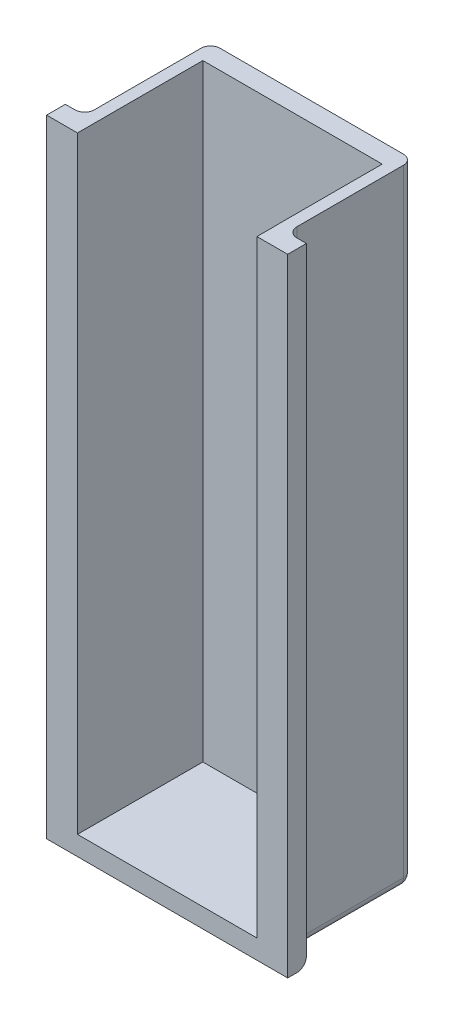
ISO-10303-21;
HEADER;
FILE_DESCRIPTION(('STEP AP214'),'2;1');
FILE_NAME('part.step','',(''),(''),'','','');
FILE_SCHEMA(('AUTOMOTIVE_DESIGN { 1 0 10303 214 1 1 1 1 }'));
ENDSEC;
DATA;
#1=APPLICATION_CONTEXT('core data for automotive mechanical design processes');
#2=APPLICATION_PROTOCOL_DEFINITION('international standard','automotive_design',2000,#1);
#3=PRODUCT_CONTEXT('',#1,'mechanical');
#4=PRODUCT('Part','Part','',(#3));
#5=PRODUCT_RELATED_PRODUCT_CATEGORY('part','',(#4));
#6=PRODUCT_DEFINITION_FORMATION('','',#4);
#7=PRODUCT_DEFINITION_CONTEXT('part definition',#1,'design');
#8=PRODUCT_DEFINITION('design','',#6,#7);
#9=PRODUCT_DEFINITION_SHAPE('','',#8);
#10=(LENGTH_UNIT() NAMED_UNIT(*) SI_UNIT(.MILLI.,.METRE.));
#11=(NAMED_UNIT(*) PLANE_ANGLE_UNIT() SI_UNIT($,.RADIAN.));
#12=(NAMED_UNIT(*) SI_UNIT($,.STERADIAN.) SOLID_ANGLE_UNIT());
#13=UNCERTAINTY_MEASURE_WITH_UNIT(LENGTH_MEASURE(1.E-05),#10,'distance_accuracy_value','');
#14=(GEOMETRIC_REPRESENTATION_CONTEXT(3) GLOBAL_UNCERTAINTY_ASSIGNED_CONTEXT((#13)) GLOBAL_UNIT_ASSIGNED_CONTEXT((#10,
#11,#12)) REPRESENTATION_CONTEXT('',''));
#15=CARTESIAN_POINT('',(0.,0.,0.));
#16=DIRECTION('',(0.,0.,1.));
#17=DIRECTION('',(1.,0.,0.));
#18=AXIS2_PLACEMENT_3D('',#15,#16,#17);
#19=CARTESIAN_POINT('',(12.5,-32.5,15.));
#20=DIRECTION('',(-1.,0.,0.));
#21=DIRECTION('',(0.,0.,1.));
#22=AXIS2_PLACEMENT_3D('',#19,#20,#21);
#23=PLANE('',#22);
#24=DIRECTION('',(0.,0.,-1.));
#25=VECTOR('',#24,1.);
#26=CARTESIAN_POINT('',(12.5,-32.5,15.));
#27=LINE('',#26,#25);
#28=CARTESIAN_POINT('',(12.5,-32.5,15.));
#29=VERTEX_POINT('',#28);
#30=CARTESIAN_POINT('',(12.5,-32.5,14.0553964783934));
#31=VERTEX_POINT('',#30);
#32=EDGE_CURVE('E230',#29,#31,#27,.T.);
#33=ORIENTED_EDGE('',*,*,#32,.T.);
#34=CARTESIAN_POINT('',(12.5,-31.5,14.0553964783934));
#35=DIRECTION('',(-1.,0.,0.));
#36=DIRECTION('',(0.,0.,1.));
#37=AXIS2_PLACEMENT_3D('',#34,#35,#36);
#38=CIRCLE('',#37,1.);
#39=CARTESIAN_POINT('',(12.5,-31.5,13.0553964783934));
#40=VERTEX_POINT('',#39);
#41=EDGE_CURVE('E265',#31,#40,#38,.F.);
#42=ORIENTED_EDGE('',*,*,#41,.T.);
#43=DIRECTION('',(0.,1.,0.));
#44=VECTOR('',#43,1.);
#45=CARTESIAN_POINT('',(12.5,-32.5,13.0553964783934));
#46=LINE('',#45,#44);
#47=CARTESIAN_POINT('',(12.5,32.5,13.0553964783934));
#48=VERTEX_POINT('',#47);
#49=EDGE_CURVE('E358',#40,#48,#46,.T.);
#50=ORIENTED_EDGE('',*,*,#49,.T.);
#51=DIRECTION('',(0.,0.,-1.));
#52=VECTOR('',#51,1.);
#53=CARTESIAN_POINT('',(12.5,32.5,15.));
#54=LINE('',#53,#52);
#55=CARTESIAN_POINT('',(12.5,32.5,15.));
#56=VERTEX_POINT('',#55);
#57=EDGE_CURVE('E239',#56,#48,#54,.T.);
#58=ORIENTED_EDGE('',*,*,#57,.F.);
#59=DIRECTION('',(0.,1.,0.));
#60=VECTOR('',#59,1.);
#61=CARTESIAN_POINT('',(12.5,-32.5,15.));
#62=LINE('',#61,#60);
#63=EDGE_CURVE('E218',#29,#56,#62,.T.);
#64=ORIENTED_EDGE('',*,*,#63,.F.);
#65=EDGE_LOOP('',(#33,#42,#50,#58,#64));
#66=FACE_BOUND('',#65,.T.);
#67=ADVANCED_FACE('F39',(#66),#23,.F.);
#68=CARTESIAN_POINT('',(-12.5,32.5,15.));
#69=DIRECTION('',(0.,-1.,0.));
#70=DIRECTION('',(0.,0.,-1.));
#71=AXIS2_PLACEMENT_3D('',#68,#69,#70);
#72=PLANE('',#71);
#73=DIRECTION('',(-1.,0.,0.));
#74=VECTOR('',#73,1.);
#75=CARTESIAN_POINT('',(-12.5,32.5,0.));
#76=LINE('',#75,#74);
#77=CARTESIAN_POINT('',(9.50269534961136,32.5,0.));
#78=VERTEX_POINT('',#77);
#79=CARTESIAN_POINT('',(-9.50269534961136,32.5,0.));
#80=VERTEX_POINT('',#79);
#81=EDGE_CURVE('E223',#78,#80,#76,.T.);
#82=ORIENTED_EDGE('',*,*,#81,.T.);
#83=CARTESIAN_POINT('',(-9.50269534961136,32.5,1.));
#84=DIRECTION('',(0.,-1.,0.));
#85=DIRECTION('',(0.,0.,-1.));
#86=AXIS2_PLACEMENT_3D('',#83,#84,#85);
#87=CIRCLE('',#86,1.);
#88=CARTESIAN_POINT('',(-10.5026953496114,32.5,1.));
#89=VERTEX_POINT('',#88);
#90=EDGE_CURVE('E289',#80,#89,#87,.F.);
#91=ORIENTED_EDGE('',*,*,#90,.T.);
#92=DIRECTION('',(0.,0.,1.));
#93=VECTOR('',#92,1.);
#94=CARTESIAN_POINT('',(-10.5026953496114,32.5,15.));
#95=LINE('',#94,#93);
#96=CARTESIAN_POINT('',(-10.5026953496114,32.5,12.0553964783934));
#97=VERTEX_POINT('',#96);
#98=EDGE_CURVE('E370',#89,#97,#95,.T.);
#99=ORIENTED_EDGE('',*,*,#98,.T.);
#100=CARTESIAN_POINT('',(-11.5026953496114,32.5,12.0553964783934));
#101=DIRECTION('',(0.,-1.,0.));
#102=DIRECTION('',(0.,0.,-1.));
#103=AXIS2_PLACEMENT_3D('',#100,#101,#102);
#104=CIRCLE('',#103,1.);
#105=CARTESIAN_POINT('',(-11.5026953496114,32.5,13.0553964783934));
#106=VERTEX_POINT('',#105);
#107=EDGE_CURVE('E48',#97,#106,#104,.T.);
#108=ORIENTED_EDGE('',*,*,#107,.T.);
#109=DIRECTION('',(-1.,0.,0.));
#110=VECTOR('',#109,1.);
#111=CARTESIAN_POINT('',(-12.5,32.5,13.0553964783934));
#112=LINE('',#111,#110);
#113=CARTESIAN_POINT('',(-12.5,32.5,13.0553964783934));
#114=VERTEX_POINT('',#113);
#115=EDGE_CURVE('E232',#106,#114,#112,.T.);
#116=ORIENTED_EDGE('',*,*,#115,.T.);
#117=DIRECTION('',(0.,0.,-1.));
#118=VECTOR('',#117,1.);
#119=CARTESIAN_POINT('',(-12.5,32.5,15.));
#120=LINE('',#119,#118);
#121=CARTESIAN_POINT('',(-12.5,32.5,15.));
#122=VERTEX_POINT('',#121);
#123=EDGE_CURVE('E215',#122,#114,#120,.T.);
#124=ORIENTED_EDGE('',*,*,#123,.F.);
#125=DIRECTION('',(-1.,0.,0.));
#126=VECTOR('',#125,1.);
#127=CARTESIAN_POINT('',(-12.5,32.5,15.));
#128=LINE('',#127,#126);
#129=CARTESIAN_POINT('',(-9.29999999999967,32.5,15.));
#130=VERTEX_POINT('',#129);
#131=EDGE_CURVE('E205',#130,#122,#128,.T.);
#132=ORIENTED_EDGE('',*,*,#131,.F.);
#133=DIRECTION('',(0.,0.,1.));
#134=VECTOR('',#133,1.);
#135=CARTESIAN_POINT('',(-9.29999999999967,32.5,1.99771840831441));
#136=LINE('',#135,#134);
#137=CARTESIAN_POINT('',(-9.29999999999967,32.5,1.99771840831441));
#138=VERTEX_POINT('',#137);
#139=EDGE_CURVE('E189',#138,#130,#136,.T.);
#140=ORIENTED_EDGE('',*,*,#139,.F.);
#141=DIRECTION('',(-1.,0.,0.));
#142=VECTOR('',#141,1.);
#143=CARTESIAN_POINT('',(-9.29999999999967,32.5,1.99771840831441));
#144=LINE('',#143,#142);
#145=CARTESIAN_POINT('',(9.29999999999967,32.5,1.99771840831441));
#146=VERTEX_POINT('',#145);
#147=EDGE_CURVE('E347',#146,#138,#144,.T.);
#148=ORIENTED_EDGE('',*,*,#147,.F.);
#149=DIRECTION('',(0.,0.,-1.));
#150=VECTOR('',#149,1.);
#151=CARTESIAN_POINT('',(9.29999999999967,32.5,1.99771840831441));
#152=LINE('',#151,#150);
#153=CARTESIAN_POINT('',(9.29999999999967,32.5,12.9625452365219));
#154=VERTEX_POINT('',#153);
#155=EDGE_CURVE('E200',#154,#146,#152,.T.);
#156=ORIENTED_EDGE('',*,*,#155,.F.);
#157=DIRECTION('',(-1.,0.,0.));
#158=VECTOR('',#157,1.);
#159=CARTESIAN_POINT('',(-9.29999999999967,32.5,12.9625452365219));
#160=LINE('',#159,#158);
#161=CARTESIAN_POINT('',(9.31058078052405,32.5,12.9625452365219));
#162=VERTEX_POINT('',#161);
#163=EDGE_CURVE('E210',#162,#154,#160,.T.);
#164=ORIENTED_EDGE('',*,*,#163,.F.);
#165=DIRECTION('',(0.,0.,-1.));
#166=VECTOR('',#165,1.);
#167=CARTESIAN_POINT('',(9.31058078052405,32.5,12.9625452365219));
#168=LINE('',#167,#166);
#169=CARTESIAN_POINT('',(9.31058078052405,32.5,15.));
#170=VERTEX_POINT('',#169);
#171=EDGE_CURVE('E326',#170,#162,#168,.T.);
#172=ORIENTED_EDGE('',*,*,#171,.F.);
#173=EDGE_CURVE('E217',#56,#170,#128,.T.);
#174=ORIENTED_EDGE('',*,*,#173,.F.);
#175=ORIENTED_EDGE('',*,*,#57,.T.);
#176=DIRECTION('',(-1.,0.,0.));
#177=VECTOR('',#176,1.);
#178=CARTESIAN_POINT('',(-12.5,32.5,13.0553964783934));
#179=LINE('',#178,#177);
#180=CARTESIAN_POINT('',(11.5026953496114,32.5,13.0553964783934));
#181=VERTEX_POINT('',#180);
#182=EDGE_CURVE('E373',#48,#181,#179,.T.);
#183=ORIENTED_EDGE('',*,*,#182,.T.);
#184=CARTESIAN_POINT('',(11.5026953496114,32.5,12.0553964783934));
#185=DIRECTION('',(0.,-1.,0.));
#186=DIRECTION('',(0.,0.,-1.));
#187=AXIS2_PLACEMENT_3D('',#184,#185,#186);
#188=CIRCLE('',#187,1.);
#189=CARTESIAN_POINT('',(10.5026953496114,32.5,12.0553964783934));
#190=VERTEX_POINT('',#189);
#191=EDGE_CURVE('E11',#181,#190,#188,.T.);
#192=ORIENTED_EDGE('',*,*,#191,.T.);
#193=DIRECTION('',(0.,0.,-1.));
#194=VECTOR('',#193,1.);
#195=CARTESIAN_POINT('',(10.5026953496114,32.5,15.));
#196=LINE('',#195,#194);
#197=CARTESIAN_POINT('',(10.5026953496114,32.5,1.));
#198=VERTEX_POINT('',#197);
#199=EDGE_CURVE('E366',#190,#198,#196,.T.);
#200=ORIENTED_EDGE('',*,*,#199,.T.);
#201=CARTESIAN_POINT('',(9.50269534961136,32.5,1.));
#202=DIRECTION('',(0.,-1.,0.));
#203=DIRECTION('',(0.,0.,-1.));
#204=AXIS2_PLACEMENT_3D('',#201,#202,#203);
#205=CIRCLE('',#204,1.);
#206=EDGE_CURVE('E287',#198,#78,#205,.F.);
#207=ORIENTED_EDGE('',*,*,#206,.T.);
#208=EDGE_LOOP('',(#82,#91,#99,#108,#116,#124,#132,#140,#148,#156,#164,#172,#174,#175,#183,#192,
#200,#207));
#209=FACE_BOUND('',#208,.T.);
#210=ADVANCED_FACE('F213',(#209),#72,.F.);
#211=CARTESIAN_POINT('',(-12.5,-32.5,15.));
#212=DIRECTION('',(1.,0.,0.));
#213=DIRECTION('',(0.,0.,-1.));
#214=AXIS2_PLACEMENT_3D('',#211,#212,#213);
#215=PLANE('',#214);
#216=DIRECTION('',(0.,1.,0.));
#217=VECTOR('',#216,1.);
#218=CARTESIAN_POINT('',(-12.5,-32.5,13.0553964783934));
#219=LINE('',#218,#217);
#220=CARTESIAN_POINT('',(-12.5,-31.5,13.0553964783934));
#221=VERTEX_POINT('',#220);
#222=EDGE_CURVE('E363',#221,#114,#219,.T.);
#223=ORIENTED_EDGE('',*,*,#222,.F.);
#224=CARTESIAN_POINT('',(-12.5,-31.5,14.0553964783934));
#225=DIRECTION('',(1.,0.,0.));
#226=DIRECTION('',(0.,0.,-1.));
#227=AXIS2_PLACEMENT_3D('',#224,#225,#226);
#228=CIRCLE('',#227,1.);
#229=CARTESIAN_POINT('',(-12.5,-32.5,14.0553964783934));
#230=VERTEX_POINT('',#229);
#231=EDGE_CURVE('E263',#221,#230,#228,.F.);
#232=ORIENTED_EDGE('',*,*,#231,.T.);
#233=DIRECTION('',(0.,0.,-1.));
#234=VECTOR('',#233,1.);
#235=CARTESIAN_POINT('',(-12.5,-32.5,15.));
#236=LINE('',#235,#234);
#237=CARTESIAN_POINT('',(-12.5,-32.5,15.));
#238=VERTEX_POINT('',#237);
#239=EDGE_CURVE('E235',#238,#230,#236,.T.);
#240=ORIENTED_EDGE('',*,*,#239,.F.);
#241=DIRECTION('',(0.,-1.,0.));
#242=VECTOR('',#241,1.);
#243=CARTESIAN_POINT('',(-12.5,-32.5,15.));
#244=LINE('',#243,#242);
#245=EDGE_CURVE('E221',#122,#238,#244,.T.);
#246=ORIENTED_EDGE('',*,*,#245,.F.);
#247=ORIENTED_EDGE('',*,*,#123,.T.);
#248=EDGE_LOOP('',(#223,#232,#240,#246,#247));
#249=FACE_BOUND('',#248,.T.);
#250=ADVANCED_FACE('F384',(#249),#215,.F.);
#251=CARTESIAN_POINT('',(-12.5,-32.5,15.));
#252=DIRECTION('',(0.,1.,0.));
#253=DIRECTION('',(0.,0.,1.));
#254=AXIS2_PLACEMENT_3D('',#251,#252,#253);
#255=PLANE('',#254);
#256=CARTESIAN_POINT('',(11.5026953496114,-32.5,12.0553964783934));
#257=DIRECTION('',(0.,1.,0.));
#258=DIRECTION('',(0.,0.,1.));
#259=AXIS2_PLACEMENT_3D('',#256,#257,#258);
#260=CIRCLE('',#259,2.);
#261=CARTESIAN_POINT('',(11.5026953496114,-32.5,14.0553964783934));
#262=VERTEX_POINT('',#261);
#263=CARTESIAN_POINT('',(9.50269534961136,-32.5,12.0553964783934));
#264=VERTEX_POINT('',#263);
#265=EDGE_CURVE('E254',#262,#264,#260,.F.);
#266=ORIENTED_EDGE('',*,*,#265,.F.);
#267=DIRECTION('',(1.,0.,0.));
#268=VECTOR('',#267,1.);
#269=CARTESIAN_POINT('',(-12.5,-32.5,14.0553964783934));
#270=LINE('',#269,#268);
#271=EDGE_CURVE('E257',#262,#31,#270,.T.);
#272=ORIENTED_EDGE('',*,*,#271,.T.);
#273=ORIENTED_EDGE('',*,*,#32,.F.);
#274=DIRECTION('',(1.,0.,0.));
#275=VECTOR('',#274,1.);
#276=CARTESIAN_POINT('',(-12.5,-32.5,15.));
#277=LINE('',#276,#275);
#278=EDGE_CURVE('E228',#238,#29,#277,.T.);
#279=ORIENTED_EDGE('',*,*,#278,.F.);
#280=ORIENTED_EDGE('',*,*,#239,.T.);
#281=DIRECTION('',(1.,0.,0.));
#282=VECTOR('',#281,1.);
#283=CARTESIAN_POINT('',(-12.5,-32.5,14.0553964783934));
#284=LINE('',#283,#282);
#285=CARTESIAN_POINT('',(-11.5026953496114,-32.5,14.0553964783934));
#286=VERTEX_POINT('',#285);
#287=EDGE_CURVE('E251',#230,#286,#284,.T.);
#288=ORIENTED_EDGE('',*,*,#287,.T.);
#289=CARTESIAN_POINT('',(-11.5026953496114,-32.5,12.0553964783934));
#290=DIRECTION('',(0.,1.,0.));
#291=DIRECTION('',(0.,0.,1.));
#292=AXIS2_PLACEMENT_3D('',#289,#290,#291);
#293=CIRCLE('',#292,2.);
#294=CARTESIAN_POINT('',(-9.50269534961136,-32.5,12.0553964783934));
#295=VERTEX_POINT('',#294);
#296=EDGE_CURVE('E248',#295,#286,#293,.F.);
#297=ORIENTED_EDGE('',*,*,#296,.F.);
#298=DIRECTION('',(0.,0.,-1.));
#299=VECTOR('',#298,1.);
#300=CARTESIAN_POINT('',(-9.50269534961136,-32.5,15.));
#301=LINE('',#300,#299);
#302=CARTESIAN_POINT('',(-9.50269534961136,-32.5,1.));
#303=VERTEX_POINT('',#302);
#304=EDGE_CURVE('E246',#295,#303,#301,.T.);
#305=ORIENTED_EDGE('',*,*,#304,.T.);
#306=DIRECTION('',(1.,0.,0.));
#307=VECTOR('',#306,1.);
#308=CARTESIAN_POINT('',(10.5026953496114,-32.5,1.));
#309=LINE('',#308,#307);
#310=CARTESIAN_POINT('',(9.50269534961136,-32.5,1.));
#311=VERTEX_POINT('',#310);
#312=EDGE_CURVE('E242',#303,#311,#309,.T.);
#313=ORIENTED_EDGE('',*,*,#312,.T.);
#314=DIRECTION('',(0.,0.,1.));
#315=VECTOR('',#314,1.);
#316=CARTESIAN_POINT('',(9.50269534961136,-32.5,15.));
#317=LINE('',#316,#315);
#318=EDGE_CURVE('E244',#311,#264,#317,.T.);
#319=ORIENTED_EDGE('',*,*,#318,.T.);
#320=EDGE_LOOP('',(#266,#272,#273,#279,#280,#288,#297,#305,#313,#319));
#321=FACE_BOUND('',#320,.T.);
#322=ADVANCED_FACE('F391',(#321),#255,.F.);
#323=CARTESIAN_POINT('',(0.,0.,15.));
#324=DIRECTION('',(0.,0.,-1.));
#325=DIRECTION('',(-1.,0.,0.));
#326=AXIS2_PLACEMENT_3D('',#323,#324,#325);
#327=PLANE('',#326);
#328=DIRECTION('',(-1.,0.,0.));
#329=VECTOR('',#328,1.);
#330=CARTESIAN_POINT('',(-9.29999999999967,-30.5,15.));
#331=LINE('',#330,#329);
#332=CARTESIAN_POINT('',(9.31058078052405,-30.5,15.));
#333=VERTEX_POINT('',#332);
#334=CARTESIAN_POINT('',(-9.29999999999967,-30.5,15.));
#335=VERTEX_POINT('',#334);
#336=EDGE_CURVE('E201',#333,#335,#331,.T.);
#337=ORIENTED_EDGE('',*,*,#336,.T.);
#338=DIRECTION('',(0.,1.,0.));
#339=VECTOR('',#338,1.);
#340=CARTESIAN_POINT('',(-9.29999999999967,-49.2217771298993,15.));
#341=LINE('',#340,#339);
#342=EDGE_CURVE('E193',#335,#130,#341,.T.);
#343=ORIENTED_EDGE('',*,*,#342,.T.);
#344=ORIENTED_EDGE('',*,*,#131,.T.);
#345=ORIENTED_EDGE('',*,*,#245,.T.);
#346=ORIENTED_EDGE('',*,*,#278,.T.);
#347=ORIENTED_EDGE('',*,*,#63,.T.);
#348=ORIENTED_EDGE('',*,*,#173,.T.);
#349=DIRECTION('',(0.,1.,0.));
#350=VECTOR('',#349,1.);
#351=CARTESIAN_POINT('',(9.31058078052405,-49.2217771298993,15.));
#352=LINE('',#351,#350);
#353=EDGE_CURVE('E209',#333,#170,#352,.T.);
#354=ORIENTED_EDGE('',*,*,#353,.F.);
#355=EDGE_LOOP('',(#337,#343,#344,#345,#346,#347,#348,#354));
#356=FACE_BOUND('',#355,.T.);
#357=ADVANCED_FACE('F204',(#356),#327,.F.);
#358=CARTESIAN_POINT('',(0.,0.,0.));
#359=DIRECTION('',(0.,0.,-1.));
#360=DIRECTION('',(-1.,0.,0.));
#361=AXIS2_PLACEMENT_3D('',#358,#359,#360);
#362=PLANE('',#361);
#363=DIRECTION('',(1.,0.,0.));
#364=VECTOR('',#363,1.);
#365=CARTESIAN_POINT('',(-10.5026953496114,-31.5,0.));
#366=LINE('',#365,#364);
#367=CARTESIAN_POINT('',(9.50269534961136,-31.5,0.));
#368=VERTEX_POINT('',#367);
#369=CARTESIAN_POINT('',(-9.50269534961136,-31.5,0.));
#370=VERTEX_POINT('',#369);
#371=EDGE_CURVE('E56',#368,#370,#366,.F.);
#372=ORIENTED_EDGE('',*,*,#371,.T.);
#373=DIRECTION('',(0.,1.,0.));
#374=VECTOR('',#373,1.);
#375=CARTESIAN_POINT('',(-9.50269534961136,32.5,0.));
#376=LINE('',#375,#374);
#377=EDGE_CURVE('E285',#370,#80,#376,.T.);
#378=ORIENTED_EDGE('',*,*,#377,.T.);
#379=ORIENTED_EDGE('',*,*,#81,.F.);
#380=DIRECTION('',(0.,1.,0.));
#381=VECTOR('',#380,1.);
#382=CARTESIAN_POINT('',(9.50269534961136,-32.5,0.));
#383=LINE('',#382,#381);
#384=EDGE_CURVE('E61',#78,#368,#383,.F.);
#385=ORIENTED_EDGE('',*,*,#384,.T.);
#386=EDGE_LOOP('',(#372,#378,#379,#385));
#387=FACE_BOUND('',#386,.T.);
#388=ADVANCED_FACE('F495',(#387),#362,.T.);
#389=CARTESIAN_POINT('',(12.5,-32.5,13.0553964783934));
#390=DIRECTION('',(0.,0.,1.));
#391=DIRECTION('',(1.,0.,0.));
#392=AXIS2_PLACEMENT_3D('',#389,#390,#391);
#393=PLANE('',#392);
#394=ORIENTED_EDGE('',*,*,#49,.F.);
#395=DIRECTION('',(1.,0.,0.));
#396=VECTOR('',#395,1.);
#397=CARTESIAN_POINT('',(12.5,-31.5,13.0553964783934));
#398=LINE('',#397,#396);
#399=CARTESIAN_POINT('',(11.5026953496114,-31.5,13.0553964783934));
#400=VERTEX_POINT('',#399);
#401=EDGE_CURVE('E269',#40,#400,#398,.F.);
#402=ORIENTED_EDGE('',*,*,#401,.T.);
#403=DIRECTION('',(0.,1.,0.));
#404=VECTOR('',#403,1.);
#405=CARTESIAN_POINT('',(11.5026953496114,32.5,13.0553964783934));
#406=LINE('',#405,#404);
#407=EDGE_CURVE('E267',#400,#181,#406,.T.);
#408=ORIENTED_EDGE('',*,*,#407,.T.);
#409=ORIENTED_EDGE('',*,*,#182,.F.);
#410=EDGE_LOOP('',(#394,#402,#408,#409));
#411=FACE_BOUND('',#410,.T.);
#412=ADVANCED_FACE('F507',(#411),#393,.F.);
#413=CARTESIAN_POINT('',(10.5026953496114,-32.5,0.));
#414=DIRECTION('',(-1.,0.,0.));
#415=DIRECTION('',(0.,0.,1.));
#416=AXIS2_PLACEMENT_3D('',#413,#414,#415);
#417=PLANE('',#416);
#418=ORIENTED_EDGE('',*,*,#199,.F.);
#419=DIRECTION('',(0.,1.,0.));
#420=VECTOR('',#419,1.);
#421=CARTESIAN_POINT('',(10.5026953496114,-32.5,12.0553964783934));
#422=LINE('',#421,#420);
#423=CARTESIAN_POINT('',(10.5026953496114,-31.5,12.0553964783934));
#424=VERTEX_POINT('',#423);
#425=EDGE_CURVE('E281',#190,#424,#422,.F.);
#426=ORIENTED_EDGE('',*,*,#425,.T.);
#427=DIRECTION('',(0.,0.,1.));
#428=VECTOR('',#427,1.);
#429=CARTESIAN_POINT('',(10.5026953496114,-31.5,0.));
#430=LINE('',#429,#428);
#431=CARTESIAN_POINT('',(10.5026953496114,-31.5,1.));
#432=VERTEX_POINT('',#431);
#433=EDGE_CURVE('E279',#424,#432,#430,.F.);
#434=ORIENTED_EDGE('',*,*,#433,.T.);
#435=DIRECTION('',(0.,1.,0.));
#436=VECTOR('',#435,1.);
#437=CARTESIAN_POINT('',(10.5026953496114,32.5,1.));
#438=LINE('',#437,#436);
#439=EDGE_CURVE('E277',#432,#198,#438,.T.);
#440=ORIENTED_EDGE('',*,*,#439,.T.);
#441=EDGE_LOOP('',(#418,#426,#434,#440));
#442=FACE_BOUND('',#441,.T.);
#443=ADVANCED_FACE('F482',(#442),#417,.F.);
#444=CARTESIAN_POINT('',(-12.5,-32.5,13.0553964783934));
#445=DIRECTION('',(0.,0.,1.));
#446=DIRECTION('',(1.,0.,0.));
#447=AXIS2_PLACEMENT_3D('',#444,#445,#446);
#448=PLANE('',#447);
#449=DIRECTION('',(0.,1.,0.));
#450=VECTOR('',#449,1.);
#451=CARTESIAN_POINT('',(-11.5026953496114,-32.5,13.0553964783934));
#452=LINE('',#451,#450);
#453=CARTESIAN_POINT('',(-11.5026953496114,-31.5,13.0553964783934));
#454=VERTEX_POINT('',#453);
#455=EDGE_CURVE('E259',#106,#454,#452,.F.);
#456=ORIENTED_EDGE('',*,*,#455,.T.);
#457=DIRECTION('',(1.,0.,0.));
#458=VECTOR('',#457,1.);
#459=CARTESIAN_POINT('',(-12.5,-31.5,13.0553964783934));
#460=LINE('',#459,#458);
#461=EDGE_CURVE('E261',#454,#221,#460,.F.);
#462=ORIENTED_EDGE('',*,*,#461,.T.);
#463=ORIENTED_EDGE('',*,*,#222,.T.);
#464=ORIENTED_EDGE('',*,*,#115,.F.);
#465=EDGE_LOOP('',(#456,#462,#463,#464));
#466=FACE_BOUND('',#465,.T.);
#467=ADVANCED_FACE('F380',(#466),#448,.F.);
#468=CARTESIAN_POINT('',(-10.5026953496114,-32.5,0.));
#469=DIRECTION('',(1.,0.,0.));
#470=DIRECTION('',(0.,0.,-1.));
#471=AXIS2_PLACEMENT_3D('',#468,#469,#470);
#472=PLANE('',#471);
#473=DIRECTION('',(0.,0.,-1.));
#474=VECTOR('',#473,1.);
#475=CARTESIAN_POINT('',(-10.5026953496114,-31.5,0.));
#476=LINE('',#475,#474);
#477=CARTESIAN_POINT('',(-10.5026953496114,-31.5,1.));
#478=VERTEX_POINT('',#477);
#479=CARTESIAN_POINT('',(-10.5026953496114,-31.5,12.0553964783934));
#480=VERTEX_POINT('',#479);
#481=EDGE_CURVE('E273',#478,#480,#476,.F.);
#482=ORIENTED_EDGE('',*,*,#481,.T.);
#483=DIRECTION('',(0.,1.,0.));
#484=VECTOR('',#483,1.);
#485=CARTESIAN_POINT('',(-10.5026953496114,32.5,12.0553964783934));
#486=LINE('',#485,#484);
#487=EDGE_CURVE('E275',#480,#97,#486,.T.);
#488=ORIENTED_EDGE('',*,*,#487,.T.);
#489=ORIENTED_EDGE('',*,*,#98,.F.);
#490=DIRECTION('',(0.,1.,0.));
#491=VECTOR('',#490,1.);
#492=CARTESIAN_POINT('',(-10.5026953496114,-32.5,1.));
#493=LINE('',#492,#491);
#494=EDGE_CURVE('E271',#89,#478,#493,.F.);
#495=ORIENTED_EDGE('',*,*,#494,.T.);
#496=EDGE_LOOP('',(#482,#488,#489,#495));
#497=FACE_BOUND('',#496,.T.);
#498=ADVANCED_FACE('F498',(#497),#472,.F.);
#499=CARTESIAN_POINT('',(-9.29999999999967,-30.5,1.99771840831441));
#500=DIRECTION('',(-1.,0.,0.));
#501=DIRECTION('',(0.,0.,1.));
#502=AXIS2_PLACEMENT_3D('',#499,#500,#501);
#503=PLANE('',#502);
#504=ORIENTED_EDGE('',*,*,#139,.T.);
#505=ORIENTED_EDGE('',*,*,#342,.F.);
#506=DIRECTION('',(0.,0.,1.));
#507=VECTOR('',#506,1.);
#508=CARTESIAN_POINT('',(-9.29999999999967,-30.5,1.99771840831441));
#509=LINE('',#508,#507);
#510=CARTESIAN_POINT('',(-9.29999999999967,-30.5,1.99771840831441));
#511=VERTEX_POINT('',#510);
#512=EDGE_CURVE('E344',#511,#335,#509,.T.);
#513=ORIENTED_EDGE('',*,*,#512,.F.);
#514=DIRECTION('',(0.,1.,0.));
#515=VECTOR('',#514,1.);
#516=CARTESIAN_POINT('',(-9.29999999999967,-30.5,1.99771840831441));
#517=LINE('',#516,#515);
#518=EDGE_CURVE('E195',#511,#138,#517,.T.);
#519=ORIENTED_EDGE('',*,*,#518,.T.);
#520=EDGE_LOOP('',(#504,#505,#513,#519));
#521=FACE_BOUND('',#520,.T.);
#522=ADVANCED_FACE('F191',(#521),#503,.F.);
#523=CARTESIAN_POINT('',(-9.29999999999967,-30.5,1.99771840831441));
#524=DIRECTION('',(0.,0.,-1.));
#525=DIRECTION('',(-1.,0.,0.));
#526=AXIS2_PLACEMENT_3D('',#523,#524,#525);
#527=PLANE('',#526);
#528=ORIENTED_EDGE('',*,*,#147,.T.);
#529=ORIENTED_EDGE('',*,*,#518,.F.);
#530=DIRECTION('',(-1.,0.,0.));
#531=VECTOR('',#530,1.);
#532=CARTESIAN_POINT('',(-9.29999999999967,-30.5,1.99771840831441));
#533=LINE('',#532,#531);
#534=CARTESIAN_POINT('',(9.29999999999967,-30.5,1.99771840831441));
#535=VERTEX_POINT('',#534);
#536=EDGE_CURVE('E350',#535,#511,#533,.T.);
#537=ORIENTED_EDGE('',*,*,#536,.F.);
#538=DIRECTION('',(0.,1.,0.));
#539=VECTOR('',#538,1.);
#540=CARTESIAN_POINT('',(9.29999999999967,-30.5,1.99771840831441));
#541=LINE('',#540,#539);
#542=EDGE_CURVE('E359',#535,#146,#541,.T.);
#543=ORIENTED_EDGE('',*,*,#542,.T.);
#544=EDGE_LOOP('',(#528,#529,#537,#543));
#545=FACE_BOUND('',#544,.T.);
#546=ADVANCED_FACE('F405',(#545),#527,.F.);
#547=CARTESIAN_POINT('',(9.29999999999967,-30.5,1.99771840831441));
#548=DIRECTION('',(1.,0.,0.));
#549=DIRECTION('',(0.,0.,-1.));
#550=AXIS2_PLACEMENT_3D('',#547,#548,#549);
#551=PLANE('',#550);
#552=ORIENTED_EDGE('',*,*,#155,.T.);
#553=ORIENTED_EDGE('',*,*,#542,.F.);
#554=DIRECTION('',(0.,0.,-1.));
#555=VECTOR('',#554,1.);
#556=CARTESIAN_POINT('',(9.29999999999967,-30.5,1.99771840831441));
#557=LINE('',#556,#555);
#558=CARTESIAN_POINT('',(9.29999999999967,-30.5,12.9625452365219));
#559=VERTEX_POINT('',#558);
#560=EDGE_CURVE('E346',#559,#535,#557,.T.);
#561=ORIENTED_EDGE('',*,*,#560,.F.);
#562=DIRECTION('',(0.,1.,0.));
#563=VECTOR('',#562,1.);
#564=CARTESIAN_POINT('',(9.29999999999967,-30.5,12.9625452365219));
#565=LINE('',#564,#563);
#566=EDGE_CURVE('E352',#559,#154,#565,.T.);
#567=ORIENTED_EDGE('',*,*,#566,.T.);
#568=EDGE_LOOP('',(#552,#553,#561,#567));
#569=FACE_BOUND('',#568,.T.);
#570=ADVANCED_FACE('F408',(#569),#551,.F.);
#571=CARTESIAN_POINT('',(0.,-30.5,0.));
#572=DIRECTION('',(0.,1.,0.));
#573=DIRECTION('',(0.,0.,1.));
#574=AXIS2_PLACEMENT_3D('',#571,#572,#573);
#575=PLANE('',#574);
#576=ORIENTED_EDGE('',*,*,#512,.T.);
#577=ORIENTED_EDGE('',*,*,#336,.F.);
#578=DIRECTION('',(0.,0.,1.));
#579=VECTOR('',#578,1.);
#580=CARTESIAN_POINT('',(9.31058078052405,-30.5,12.9625452365219));
#581=LINE('',#580,#579);
#582=CARTESIAN_POINT('',(9.31058078052405,-30.5,12.9625452365219));
#583=VERTEX_POINT('',#582);
#584=EDGE_CURVE('E341',#583,#333,#581,.T.);
#585=ORIENTED_EDGE('',*,*,#584,.F.);
#586=DIRECTION('',(1.,0.,0.));
#587=VECTOR('',#586,1.);
#588=CARTESIAN_POINT('',(-9.29999999999967,-30.5,12.9625452365219));
#589=LINE('',#588,#587);
#590=EDGE_CURVE('E336',#559,#583,#589,.T.);
#591=ORIENTED_EDGE('',*,*,#590,.F.);
#592=ORIENTED_EDGE('',*,*,#560,.T.);
#593=ORIENTED_EDGE('',*,*,#536,.T.);
#594=EDGE_LOOP('',(#576,#577,#585,#591,#592,#593));
#595=FACE_BOUND('',#594,.T.);
#596=ADVANCED_FACE('F401',(#595),#575,.T.);
#597=CARTESIAN_POINT('',(-9.29999999999967,-49.2217771298993,12.9625452365219));
#598=DIRECTION('',(0.,0.,-1.));
#599=DIRECTION('',(-1.,0.,0.));
#600=AXIS2_PLACEMENT_3D('',#597,#598,#599);
#601=PLANE('',#600);
#602=ORIENTED_EDGE('',*,*,#590,.T.);
#603=DIRECTION('',(0.,1.,0.));
#604=VECTOR('',#603,1.);
#605=CARTESIAN_POINT('',(9.31058078052405,-49.2217771298993,12.9625452365219));
#606=LINE('',#605,#604);
#607=EDGE_CURVE('E339',#583,#162,#606,.T.);
#608=ORIENTED_EDGE('',*,*,#607,.T.);
#609=ORIENTED_EDGE('',*,*,#163,.T.);
#610=ORIENTED_EDGE('',*,*,#566,.F.);
#611=EDGE_LOOP('',(#602,#608,#609,#610));
#612=FACE_BOUND('',#611,.T.);
#613=ADVANCED_FACE('F411',(#612),#601,.F.);
#614=CARTESIAN_POINT('',(9.31058078052405,-49.2217771298993,12.9625452365219));
#615=DIRECTION('',(1.,0.,0.));
#616=DIRECTION('',(0.,0.,-1.));
#617=AXIS2_PLACEMENT_3D('',#614,#615,#616);
#618=PLANE('',#617);
#619=ORIENTED_EDGE('',*,*,#584,.T.);
#620=ORIENTED_EDGE('',*,*,#353,.T.);
#621=ORIENTED_EDGE('',*,*,#171,.T.);
#622=ORIENTED_EDGE('',*,*,#607,.F.);
#623=EDGE_LOOP('',(#619,#620,#621,#622));
#624=FACE_BOUND('',#623,.T.);
#625=ADVANCED_FACE('F398',(#624),#618,.F.);
#626=CARTESIAN_POINT('',(-12.5,-31.5,14.0553964783934));
#627=DIRECTION('',(1.,0.,0.));
#628=DIRECTION('',(0.,0.,-1.));
#629=AXIS2_PLACEMENT_3D('',#626,#627,#628);
#630=CYLINDRICAL_SURFACE('',#629,1.);
#631=ORIENTED_EDGE('',*,*,#41,.F.);
#632=ORIENTED_EDGE('',*,*,#271,.F.);
#633=CARTESIAN_POINT('',(11.5026953496114,-31.5,14.0553964783934));
#634=DIRECTION('',(-1.,0.,0.));
#635=DIRECTION('',(0.,0.,1.));
#636=AXIS2_PLACEMENT_3D('',#633,#634,#635);
#637=CIRCLE('',#636,1.);
#638=EDGE_CURVE('E43',#400,#262,#637,.T.);
#639=ORIENTED_EDGE('',*,*,#638,.F.);
#640=ORIENTED_EDGE('',*,*,#401,.F.);
#641=EDGE_LOOP('',(#631,#632,#639,#640));
#642=FACE_BOUND('',#641,.T.);
#643=ADVANCED_FACE('F41',(#642),#630,.T.);
#644=CARTESIAN_POINT('',(11.5026953496114,-32.5,12.0553964783934));
#645=DIRECTION('',(0.,-1.,0.));
#646=DIRECTION('',(0.,0.,-1.));
#647=AXIS2_PLACEMENT_3D('',#644,#645,#646);
#648=CYLINDRICAL_SURFACE('',#647,1.);
#649=ORIENTED_EDGE('',*,*,#191,.F.);
#650=ORIENTED_EDGE('',*,*,#407,.F.);
#651=CARTESIAN_POINT('',(11.5026953496114,-31.5,12.0553964783934));
#652=DIRECTION('',(0.,1.,0.));
#653=DIRECTION('',(0.,0.,1.));
#654=AXIS2_PLACEMENT_3D('',#651,#652,#653);
#655=CIRCLE('',#654,1.);
#656=EDGE_CURVE('E320',#424,#400,#655,.T.);
#657=ORIENTED_EDGE('',*,*,#656,.F.);
#658=ORIENTED_EDGE('',*,*,#425,.F.);
#659=EDGE_LOOP('',(#649,#650,#657,#658));
#660=FACE_BOUND('',#659,.T.);
#661=ADVANCED_FACE('F470',(#660),#648,.F.);
#662=CARTESIAN_POINT('',(11.5026953496114,-31.5,12.0553964783934));
#663=DIRECTION('',(0.,1.,0.));
#664=DIRECTION('',(0.,0.,1.));
#665=AXIS2_PLACEMENT_3D('',#662,#663,#664);
#666=TOROIDAL_SURFACE('',#665,2.,1.);
#667=ORIENTED_EDGE('',*,*,#638,.T.);
#668=ORIENTED_EDGE('',*,*,#265,.T.);
#669=CARTESIAN_POINT('',(9.50269534961136,-31.5,12.0553964783934));
#670=DIRECTION('',(0.,0.,1.));
#671=DIRECTION('',(1.,0.,0.));
#672=AXIS2_PLACEMENT_3D('',#669,#670,#671);
#673=CIRCLE('',#672,1.);
#674=EDGE_CURVE('E318',#424,#264,#673,.F.);
#675=ORIENTED_EDGE('',*,*,#674,.F.);
#676=ORIENTED_EDGE('',*,*,#656,.T.);
#677=EDGE_LOOP('',(#667,#668,#675,#676));
#678=FACE_BOUND('',#677,.T.);
#679=ADVANCED_FACE('F467',(#678),#666,.T.);
#680=CARTESIAN_POINT('',(9.50269534961136,-31.5,15.));
#681=DIRECTION('',(0.,0.,1.));
#682=DIRECTION('',(1.,0.,0.));
#683=AXIS2_PLACEMENT_3D('',#680,#681,#682);
#684=CYLINDRICAL_SURFACE('',#683,1.);
#685=ORIENTED_EDGE('',*,*,#674,.T.);
#686=ORIENTED_EDGE('',*,*,#318,.F.);
#687=CARTESIAN_POINT('',(9.50269534961136,-31.5,1.));
#688=DIRECTION('',(0.,0.,-1.));
#689=DIRECTION('',(0.,1.,0.));
#690=AXIS2_PLACEMENT_3D('',#687,#688,#689);
#691=CIRCLE('',#690,1.);
#692=EDGE_CURVE('E315',#432,#311,#691,.T.);
#693=ORIENTED_EDGE('',*,*,#692,.F.);
#694=ORIENTED_EDGE('',*,*,#433,.F.);
#695=EDGE_LOOP('',(#685,#686,#693,#694));
#696=FACE_BOUND('',#695,.T.);
#697=ADVANCED_FACE('F463',(#696),#684,.T.);
#698=CARTESIAN_POINT('',(9.50269534961136,-32.5,1.));
#699=DIRECTION('',(0.,-1.,0.));
#700=DIRECTION('',(0.,0.,-1.));
#701=AXIS2_PLACEMENT_3D('',#698,#699,#700);
#702=CYLINDRICAL_SURFACE('',#701,1.);
#703=ORIENTED_EDGE('',*,*,#206,.F.);
#704=ORIENTED_EDGE('',*,*,#439,.F.);
#705=CARTESIAN_POINT('',(9.50269534961136,-31.5,1.));
#706=DIRECTION('',(0.,-1.,0.));
#707=DIRECTION('',(0.,0.,-1.));
#708=AXIS2_PLACEMENT_3D('',#705,#706,#707);
#709=CIRCLE('',#708,1.);
#710=EDGE_CURVE('E312',#368,#432,#709,.T.);
#711=ORIENTED_EDGE('',*,*,#710,.F.);
#712=ORIENTED_EDGE('',*,*,#384,.F.);
#713=EDGE_LOOP('',(#703,#704,#711,#712));
#714=FACE_BOUND('',#713,.T.);
#715=ADVANCED_FACE('F459',(#714),#702,.T.);
#716=CARTESIAN_POINT('',(9.50269534961136,-31.5,1.));
#717=DIRECTION('',(1.,0.,0.));
#718=DIRECTION('',(0.,0.,-1.));
#719=AXIS2_PLACEMENT_3D('',#716,#717,#718);
#720=SPHERICAL_SURFACE('',#719,1.);
#721=ORIENTED_EDGE('',*,*,#710,.T.);
#722=ORIENTED_EDGE('',*,*,#692,.T.);
#723=CARTESIAN_POINT('',(9.50269534961136,-31.5,1.));
#724=DIRECTION('',(1.,0.,0.));
#725=DIRECTION('',(0.,0.,-1.));
#726=AXIS2_PLACEMENT_3D('',#723,#724,#725);
#727=CIRCLE('',#726,1.);
#728=EDGE_CURVE('E309',#368,#311,#727,.F.);
#729=ORIENTED_EDGE('',*,*,#728,.F.);
#730=EDGE_LOOP('',(#721,#722,#729));
#731=FACE_BOUND('',#730,.T.);
#732=ADVANCED_FACE('F455',(#731),#720,.T.);
#733=CARTESIAN_POINT('',(-12.5,-31.5,1.));
#734=DIRECTION('',(-1.,0.,0.));
#735=DIRECTION('',(0.,0.,1.));
#736=AXIS2_PLACEMENT_3D('',#733,#734,#735);
#737=CYLINDRICAL_SURFACE('',#736,1.);
#738=ORIENTED_EDGE('',*,*,#728,.T.);
#739=ORIENTED_EDGE('',*,*,#312,.F.);
#740=CARTESIAN_POINT('',(-9.50269534961136,-31.5,1.));
#741=DIRECTION('',(-1.,0.,0.));
#742=DIRECTION('',(0.,0.,1.));
#743=AXIS2_PLACEMENT_3D('',#740,#741,#742);
#744=CIRCLE('',#743,1.);
#745=EDGE_CURVE('E306',#370,#303,#744,.T.);
#746=ORIENTED_EDGE('',*,*,#745,.F.);
#747=ORIENTED_EDGE('',*,*,#371,.F.);
#748=EDGE_LOOP('',(#738,#739,#746,#747));
#749=FACE_BOUND('',#748,.T.);
#750=ADVANCED_FACE('F451',(#749),#737,.T.);
#751=CARTESIAN_POINT('',(-9.50269534961136,0.,1.));
#752=DIRECTION('',(0.,-1.,0.));
#753=DIRECTION('',(0.,0.,-1.));
#754=AXIS2_PLACEMENT_3D('',#751,#752,#753);
#755=CYLINDRICAL_SURFACE('',#754,1.);
#756=ORIENTED_EDGE('',*,*,#90,.F.);
#757=ORIENTED_EDGE('',*,*,#377,.F.);
#758=CARTESIAN_POINT('',(-9.50269534961136,-31.5,1.));
#759=DIRECTION('',(0.,-1.,0.));
#760=DIRECTION('',(0.,0.,-1.));
#761=AXIS2_PLACEMENT_3D('',#758,#759,#760);
#762=CIRCLE('',#761,1.);
#763=EDGE_CURVE('E303',#478,#370,#762,.T.);
#764=ORIENTED_EDGE('',*,*,#763,.F.);
#765=ORIENTED_EDGE('',*,*,#494,.F.);
#766=EDGE_LOOP('',(#756,#757,#764,#765));
#767=FACE_BOUND('',#766,.T.);
#768=ADVANCED_FACE('F447',(#767),#755,.T.);
#769=CARTESIAN_POINT('',(-9.50269534961136,-31.5,1.));
#770=DIRECTION('',(0.,0.,-1.));
#771=DIRECTION('',(-1.,0.,0.));
#772=AXIS2_PLACEMENT_3D('',#769,#770,#771);
#773=SPHERICAL_SURFACE('',#772,1.);
#774=ORIENTED_EDGE('',*,*,#763,.T.);
#775=ORIENTED_EDGE('',*,*,#745,.T.);
#776=CARTESIAN_POINT('',(-9.50269534961136,-31.5,1.));
#777=DIRECTION('',(0.,0.,-1.));
#778=DIRECTION('',(-1.,0.,0.));
#779=AXIS2_PLACEMENT_3D('',#776,#777,#778);
#780=CIRCLE('',#779,1.);
#781=EDGE_CURVE('E300',#478,#303,#780,.F.);
#782=ORIENTED_EDGE('',*,*,#781,.F.);
#783=EDGE_LOOP('',(#774,#775,#782));
#784=FACE_BOUND('',#783,.T.);
#785=ADVANCED_FACE('F443',(#784),#773,.T.);
#786=CARTESIAN_POINT('',(-9.50269534961136,-31.5,15.));
#787=DIRECTION('',(0.,0.,-1.));
#788=DIRECTION('',(-1.,0.,0.));
#789=AXIS2_PLACEMENT_3D('',#786,#787,#788);
#790=CYLINDRICAL_SURFACE('',#789,1.);
#791=ORIENTED_EDGE('',*,*,#781,.T.);
#792=ORIENTED_EDGE('',*,*,#304,.F.);
#793=CARTESIAN_POINT('',(-9.50269534961136,-31.5,12.0553964783934));
#794=DIRECTION('',(0.,0.,1.));
#795=DIRECTION('',(1.,0.,0.));
#796=AXIS2_PLACEMENT_3D('',#793,#794,#795);
#797=CIRCLE('',#796,1.);
#798=EDGE_CURVE('E297',#480,#295,#797,.T.);
#799=ORIENTED_EDGE('',*,*,#798,.F.);
#800=ORIENTED_EDGE('',*,*,#481,.F.);
#801=EDGE_LOOP('',(#791,#792,#799,#800));
#802=FACE_BOUND('',#801,.T.);
#803=ADVANCED_FACE('F439',(#802),#790,.T.);
#804=CARTESIAN_POINT('',(-11.5026953496114,-32.5,12.0553964783934));
#805=DIRECTION('',(0.,-1.,0.));
#806=DIRECTION('',(0.,0.,-1.));
#807=AXIS2_PLACEMENT_3D('',#804,#805,#806);
#808=CYLINDRICAL_SURFACE('',#807,1.);
#809=ORIENTED_EDGE('',*,*,#107,.F.);
#810=ORIENTED_EDGE('',*,*,#487,.F.);
#811=CARTESIAN_POINT('',(-11.5026953496114,-31.5,12.0553964783934));
#812=DIRECTION('',(0.,1.,0.));
#813=DIRECTION('',(0.,0.,1.));
#814=AXIS2_PLACEMENT_3D('',#811,#812,#813);
#815=CIRCLE('',#814,1.);
#816=EDGE_CURVE('E294',#454,#480,#815,.T.);
#817=ORIENTED_EDGE('',*,*,#816,.F.);
#818=ORIENTED_EDGE('',*,*,#455,.F.);
#819=EDGE_LOOP('',(#809,#810,#817,#818));
#820=FACE_BOUND('',#819,.T.);
#821=ADVANCED_FACE('F435',(#820),#808,.F.);
#822=CARTESIAN_POINT('',(-11.5026953496114,-31.5,12.0553964783934));
#823=DIRECTION('',(0.,1.,0.));
#824=DIRECTION('',(0.,0.,1.));
#825=AXIS2_PLACEMENT_3D('',#822,#823,#824);
#826=TOROIDAL_SURFACE('',#825,2.,1.);
#827=ORIENTED_EDGE('',*,*,#798,.T.);
#828=ORIENTED_EDGE('',*,*,#296,.T.);
#829=CARTESIAN_POINT('',(-11.5026953496114,-31.5,14.0553964783934));
#830=DIRECTION('',(1.,0.,0.));
#831=DIRECTION('',(0.,0.,-1.));
#832=AXIS2_PLACEMENT_3D('',#829,#830,#831);
#833=CIRCLE('',#832,1.);
#834=EDGE_CURVE('E292',#454,#286,#833,.F.);
#835=ORIENTED_EDGE('',*,*,#834,.F.);
#836=ORIENTED_EDGE('',*,*,#816,.T.);
#837=EDGE_LOOP('',(#827,#828,#835,#836));
#838=FACE_BOUND('',#837,.T.);
#839=ADVANCED_FACE('F431',(#838),#826,.T.);
#840=CARTESIAN_POINT('',(-12.5,-31.5,14.0553964783934));
#841=DIRECTION('',(1.,0.,0.));
#842=DIRECTION('',(0.,0.,-1.));
#843=AXIS2_PLACEMENT_3D('',#840,#841,#842);
#844=CYLINDRICAL_SURFACE('',#843,1.);
#845=ORIENTED_EDGE('',*,*,#231,.F.);
#846=ORIENTED_EDGE('',*,*,#461,.F.);
#847=ORIENTED_EDGE('',*,*,#834,.T.);
#848=ORIENTED_EDGE('',*,*,#287,.F.);
#849=EDGE_LOOP('',(#845,#846,#847,#848));
#850=FACE_BOUND('',#849,.T.);
#851=ADVANCED_FACE('F428',(#850),#844,.T.);
#852=CLOSED_SHELL('',(#67,#210,#250,#322,#357,#388,#412,#443,#467,#498,#522,#546,#570,#596,#613,
#625,#643,#661,#679,#697,#715,#732,#750,#768,#785,#803,#821,#839,#851));
#853=MANIFOLD_SOLID_BREP('B2',#852);
#854=ADVANCED_BREP_SHAPE_REPRESENTATION('',(#18,#853),#14);
#855=SHAPE_DEFINITION_REPRESENTATION(#9,#854);
ENDSEC;
END-ISO-10303-21;
